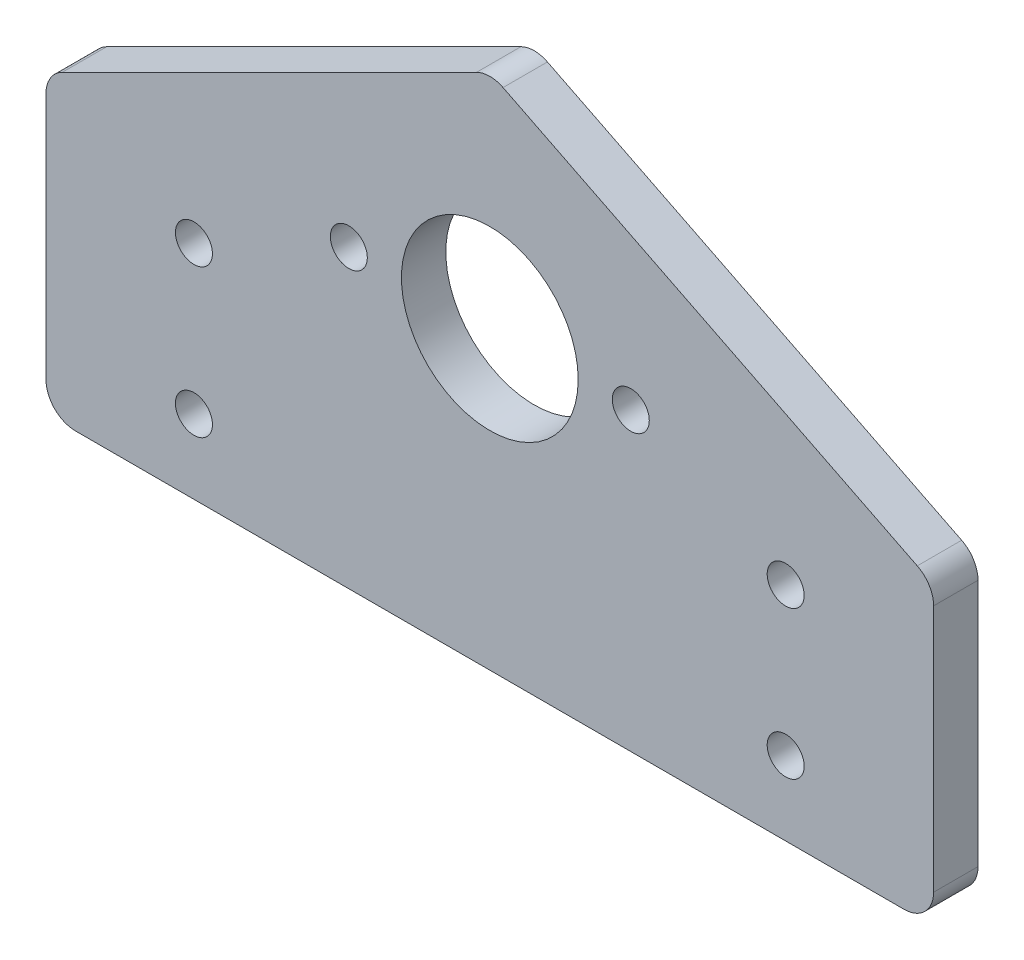
ISO-10303-21;
HEADER;
FILE_DESCRIPTION(('STEP AP214'),'2;1');
FILE_NAME('part.step','',(''),(''),'','','');
FILE_SCHEMA(('AUTOMOTIVE_DESIGN { 1 0 10303 214 1 1 1 1 }'));
ENDSEC;
DATA;
#1=APPLICATION_CONTEXT('core data for automotive mechanical design processes');
#2=APPLICATION_PROTOCOL_DEFINITION('international standard','automotive_design',2000,#1);
#3=PRODUCT_CONTEXT('',#1,'mechanical');
#4=PRODUCT('Part','Part','',(#3));
#5=PRODUCT_RELATED_PRODUCT_CATEGORY('part','',(#4));
#6=PRODUCT_DEFINITION_FORMATION('','',#4);
#7=PRODUCT_DEFINITION_CONTEXT('part definition',#1,'design');
#8=PRODUCT_DEFINITION('design','',#6,#7);
#9=PRODUCT_DEFINITION_SHAPE('','',#8);
#10=(LENGTH_UNIT() NAMED_UNIT(*) SI_UNIT(.MILLI.,.METRE.));
#11=(NAMED_UNIT(*) PLANE_ANGLE_UNIT() SI_UNIT($,.RADIAN.));
#12=(NAMED_UNIT(*) SI_UNIT($,.STERADIAN.) SOLID_ANGLE_UNIT());
#13=UNCERTAINTY_MEASURE_WITH_UNIT(LENGTH_MEASURE(1.E-05),#10,'distance_accuracy_value','');
#14=(GEOMETRIC_REPRESENTATION_CONTEXT(3) GLOBAL_UNCERTAINTY_ASSIGNED_CONTEXT((#13)) GLOBAL_UNIT_ASSIGNED_CONTEXT((#10,
#11,#12)) REPRESENTATION_CONTEXT('',''));
#15=CARTESIAN_POINT('',(0.,0.,0.));
#16=DIRECTION('',(0.,0.,1.));
#17=DIRECTION('',(1.,0.,0.));
#18=AXIS2_PLACEMENT_3D('',#15,#16,#17);
#19=CARTESIAN_POINT('',(0.,0.,3.));
#20=DIRECTION('',(0.,0.,-1.));
#21=DIRECTION('',(-1.,0.,0.));
#22=AXIS2_PLACEMENT_3D('',#19,#20,#21);
#23=PLANE('',#22);
#24=CARTESIAN_POINT('',(50.,5.,3.));
#25=DIRECTION('',(0.,0.,1.));
#26=DIRECTION('',(1.,0.,0.));
#27=AXIS2_PLACEMENT_3D('',#24,#25,#26);
#28=CIRCLE('',#27,1.25);
#29=CARTESIAN_POINT('',(51.25,5.,3.));
#30=VERTEX_POINT('',#29);
#31=EDGE_CURVE('E214',#30,#30,#28,.T.);
#32=ORIENTED_EDGE('',*,*,#31,.F.);
#33=EDGE_LOOP('',(#32));
#34=FACE_BOUND('',#33,.T.);
#35=CARTESIAN_POINT('',(10.,5.,3.));
#36=DIRECTION('',(0.,0.,1.));
#37=DIRECTION('',(1.,0.,0.));
#38=AXIS2_PLACEMENT_3D('',#35,#36,#37);
#39=CIRCLE('',#38,1.25);
#40=CARTESIAN_POINT('',(11.25,5.,3.));
#41=VERTEX_POINT('',#40);
#42=EDGE_CURVE('E220',#41,#41,#39,.T.);
#43=ORIENTED_EDGE('',*,*,#42,.F.);
#44=EDGE_LOOP('',(#43));
#45=FACE_BOUND('',#44,.T.);
#46=CARTESIAN_POINT('',(10.,15.,3.));
#47=DIRECTION('',(0.,0.,1.));
#48=DIRECTION('',(1.,0.,0.));
#49=AXIS2_PLACEMENT_3D('',#46,#47,#48);
#50=CIRCLE('',#49,1.25);
#51=CARTESIAN_POINT('',(11.25,15.,3.));
#52=VERTEX_POINT('',#51);
#53=EDGE_CURVE('E226',#52,#52,#50,.T.);
#54=ORIENTED_EDGE('',*,*,#53,.F.);
#55=EDGE_LOOP('',(#54));
#56=FACE_BOUND('',#55,.T.);
#57=CARTESIAN_POINT('',(50.,15.,3.));
#58=DIRECTION('',(0.,0.,1.));
#59=DIRECTION('',(1.,0.,0.));
#60=AXIS2_PLACEMENT_3D('',#57,#58,#59);
#61=CIRCLE('',#60,1.25);
#62=CARTESIAN_POINT('',(51.25,15.,3.));
#63=VERTEX_POINT('',#62);
#64=EDGE_CURVE('E208',#63,#63,#61,.T.);
#65=ORIENTED_EDGE('',*,*,#64,.F.);
#66=EDGE_LOOP('',(#65));
#67=FACE_BOUND('',#66,.T.);
#68=DIRECTION('',(0.,-1.,0.));
#69=VECTOR('',#68,1.);
#70=CARTESIAN_POINT('',(0.,0.,3.));
#71=LINE('',#70,#69);
#72=CARTESIAN_POINT('',(0.,18.7639320225002,3.));
#73=VERTEX_POINT('',#72);
#74=CARTESIAN_POINT('',(0.,2.,3.));
#75=VERTEX_POINT('',#74);
#76=EDGE_CURVE('E132',#73,#75,#71,.T.);
#77=ORIENTED_EDGE('',*,*,#76,.T.);
#78=CARTESIAN_POINT('',(2.,2.,3.));
#79=DIRECTION('',(0.,0.,-1.));
#80=DIRECTION('',(-1.,0.,0.));
#81=AXIS2_PLACEMENT_3D('',#78,#79,#80);
#82=CIRCLE('',#81,2.);
#83=CARTESIAN_POINT('',(2.,0.,3.));
#84=VERTEX_POINT('',#83);
#85=EDGE_CURVE('E158',#75,#84,#82,.F.);
#86=ORIENTED_EDGE('',*,*,#85,.T.);
#87=DIRECTION('',(1.,0.,0.));
#88=VECTOR('',#87,1.);
#89=CARTESIAN_POINT('',(60.,0.,3.));
#90=LINE('',#89,#88);
#91=CARTESIAN_POINT('',(58.,0.,3.));
#92=VERTEX_POINT('',#91);
#93=EDGE_CURVE('E115',#84,#92,#90,.T.);
#94=ORIENTED_EDGE('',*,*,#93,.T.);
#95=CARTESIAN_POINT('',(58.,2.,3.));
#96=DIRECTION('',(0.,0.,-1.));
#97=DIRECTION('',(-1.,0.,0.));
#98=AXIS2_PLACEMENT_3D('',#95,#96,#97);
#99=CIRCLE('',#98,2.);
#100=CARTESIAN_POINT('',(60.,2.,3.));
#101=VERTEX_POINT('',#100);
#102=EDGE_CURVE('E151',#92,#101,#99,.F.);
#103=ORIENTED_EDGE('',*,*,#102,.T.);
#104=DIRECTION('',(0.,1.,0.));
#105=VECTOR('',#104,1.);
#106=CARTESIAN_POINT('',(60.,20.,3.));
#107=LINE('',#106,#105);
#108=CARTESIAN_POINT('',(60.,18.7639320225002,3.));
#109=VERTEX_POINT('',#108);
#110=EDGE_CURVE('E175',#101,#109,#107,.T.);
#111=ORIENTED_EDGE('',*,*,#110,.T.);
#112=CARTESIAN_POINT('',(58.,18.7639320225002,3.));
#113=DIRECTION('',(0.,0.,-1.));
#114=DIRECTION('',(-1.,0.,0.));
#115=AXIS2_PLACEMENT_3D('',#112,#113,#114);
#116=CIRCLE('',#115,2.);
#117=CARTESIAN_POINT('',(58.8944271909999,20.5527864045,3.));
#118=VERTEX_POINT('',#117);
#119=EDGE_CURVE('E153',#109,#118,#116,.F.);
#120=ORIENTED_EDGE('',*,*,#119,.T.);
#121=DIRECTION('',(-0.894427190999916,0.447213595499958,0.));
#122=VECTOR('',#121,1.);
#123=CARTESIAN_POINT('',(30.,35.,3.));
#124=LINE('',#123,#122);
#125=CARTESIAN_POINT('',(30.8944271909999,34.5527864045001,3.));
#126=VERTEX_POINT('',#125);
#127=EDGE_CURVE('E187',#118,#126,#124,.T.);
#128=ORIENTED_EDGE('',*,*,#127,.T.);
#129=CARTESIAN_POINT('',(30.,32.7639320225002,3.));
#130=DIRECTION('',(0.,0.,-1.));
#131=DIRECTION('',(-1.,0.,0.));
#132=AXIS2_PLACEMENT_3D('',#129,#130,#131);
#133=CIRCLE('',#132,2.);
#134=CARTESIAN_POINT('',(29.1055728090001,34.5527864045001,3.));
#135=VERTEX_POINT('',#134);
#136=EDGE_CURVE('E39',#126,#135,#133,.F.);
#137=ORIENTED_EDGE('',*,*,#136,.T.);
#138=DIRECTION('',(-0.894427190999916,-0.447213595499958,0.));
#139=VECTOR('',#138,1.);
#140=CARTESIAN_POINT('',(0.,20.,3.));
#141=LINE('',#140,#139);
#142=CARTESIAN_POINT('',(1.10557280900009,20.5527864045,3.));
#143=VERTEX_POINT('',#142);
#144=EDGE_CURVE('E188',#135,#143,#141,.T.);
#145=ORIENTED_EDGE('',*,*,#144,.T.);
#146=CARTESIAN_POINT('',(2.,18.7639320225002,3.));
#147=DIRECTION('',(0.,0.,-1.));
#148=DIRECTION('',(-1.,0.,0.));
#149=AXIS2_PLACEMENT_3D('',#146,#147,#148);
#150=CIRCLE('',#149,2.);
#151=EDGE_CURVE('E156',#143,#73,#150,.F.);
#152=ORIENTED_EDGE('',*,*,#151,.T.);
#153=EDGE_LOOP('',(#77,#86,#94,#103,#111,#120,#128,#137,#145,#152));
#154=FACE_BOUND('',#153,.T.);
#155=CARTESIAN_POINT('',(30.,20.,3.));
#156=DIRECTION('',(0.,0.,1.));
#157=DIRECTION('',(1.,0.,0.));
#158=AXIS2_PLACEMENT_3D('',#155,#156,#157);
#159=CIRCLE('',#158,5.975);
#160=CARTESIAN_POINT('',(35.975,20.,3.));
#161=VERTEX_POINT('',#160);
#162=EDGE_CURVE('E123',#161,#161,#159,.T.);
#163=ORIENTED_EDGE('',*,*,#162,.F.);
#164=EDGE_LOOP('',(#163));
#165=FACE_BOUND('',#164,.T.);
#166=CARTESIAN_POINT('',(20.47,20.,3.));
#167=DIRECTION('',(0.,0.,1.));
#168=DIRECTION('',(1.,0.,0.));
#169=AXIS2_PLACEMENT_3D('',#166,#167,#168);
#170=CIRCLE('',#169,1.25);
#171=CARTESIAN_POINT('',(21.72,20.,3.));
#172=VERTEX_POINT('',#171);
#173=EDGE_CURVE('E194',#172,#172,#170,.T.);
#174=ORIENTED_EDGE('',*,*,#173,.F.);
#175=EDGE_LOOP('',(#174));
#176=FACE_BOUND('',#175,.T.);
#177=CARTESIAN_POINT('',(39.53,20.,3.));
#178=DIRECTION('',(0.,0.,1.));
#179=DIRECTION('',(1.,0.,0.));
#180=AXIS2_PLACEMENT_3D('',#177,#178,#179);
#181=CIRCLE('',#180,1.25);
#182=CARTESIAN_POINT('',(40.78,20.,3.));
#183=VERTEX_POINT('',#182);
#184=EDGE_CURVE('E199',#183,#183,#181,.T.);
#185=ORIENTED_EDGE('',*,*,#184,.F.);
#186=EDGE_LOOP('',(#185));
#187=FACE_BOUND('',#186,.T.);
#188=ADVANCED_FACE('F17',(#34,#45,#56,#67,#154,#165,#176,#187),#23,.F.);
#189=CARTESIAN_POINT('',(0.,0.,0.));
#190=DIRECTION('',(0.,0.,-1.));
#191=DIRECTION('',(-1.,0.,0.));
#192=AXIS2_PLACEMENT_3D('',#189,#190,#191);
#193=PLANE('',#192);
#194=CARTESIAN_POINT('',(50.,5.,0.));
#195=DIRECTION('',(0.,0.,1.));
#196=DIRECTION('',(1.,0.,0.));
#197=AXIS2_PLACEMENT_3D('',#194,#195,#196);
#198=CIRCLE('',#197,1.25);
#199=CARTESIAN_POINT('',(51.25,5.,0.));
#200=VERTEX_POINT('',#199);
#201=EDGE_CURVE('E217',#200,#200,#198,.T.);
#202=ORIENTED_EDGE('',*,*,#201,.T.);
#203=EDGE_LOOP('',(#202));
#204=FACE_BOUND('',#203,.T.);
#205=CARTESIAN_POINT('',(10.,5.,0.));
#206=DIRECTION('',(0.,0.,1.));
#207=DIRECTION('',(1.,0.,0.));
#208=AXIS2_PLACEMENT_3D('',#205,#206,#207);
#209=CIRCLE('',#208,1.25);
#210=CARTESIAN_POINT('',(11.25,5.,0.));
#211=VERTEX_POINT('',#210);
#212=EDGE_CURVE('E223',#211,#211,#209,.T.);
#213=ORIENTED_EDGE('',*,*,#212,.T.);
#214=EDGE_LOOP('',(#213));
#215=FACE_BOUND('',#214,.T.);
#216=CARTESIAN_POINT('',(10.,15.,0.));
#217=DIRECTION('',(0.,0.,1.));
#218=DIRECTION('',(1.,0.,0.));
#219=AXIS2_PLACEMENT_3D('',#216,#217,#218);
#220=CIRCLE('',#219,1.25);
#221=CARTESIAN_POINT('',(11.25,15.,0.));
#222=VERTEX_POINT('',#221);
#223=EDGE_CURVE('E211',#222,#222,#220,.T.);
#224=ORIENTED_EDGE('',*,*,#223,.T.);
#225=EDGE_LOOP('',(#224));
#226=FACE_BOUND('',#225,.T.);
#227=CARTESIAN_POINT('',(50.,15.,0.));
#228=DIRECTION('',(0.,0.,1.));
#229=DIRECTION('',(1.,0.,0.));
#230=AXIS2_PLACEMENT_3D('',#227,#228,#229);
#231=CIRCLE('',#230,1.25);
#232=CARTESIAN_POINT('',(51.25,15.,0.));
#233=VERTEX_POINT('',#232);
#234=EDGE_CURVE('E205',#233,#233,#231,.T.);
#235=ORIENTED_EDGE('',*,*,#234,.T.);
#236=EDGE_LOOP('',(#235));
#237=FACE_BOUND('',#236,.T.);
#238=CARTESIAN_POINT('',(20.47,20.,0.));
#239=DIRECTION('',(0.,0.,1.));
#240=DIRECTION('',(1.,0.,0.));
#241=AXIS2_PLACEMENT_3D('',#238,#239,#240);
#242=CIRCLE('',#241,1.25);
#243=CARTESIAN_POINT('',(21.72,20.,0.));
#244=VERTEX_POINT('',#243);
#245=EDGE_CURVE('E196',#244,#244,#242,.T.);
#246=ORIENTED_EDGE('',*,*,#245,.T.);
#247=EDGE_LOOP('',(#246));
#248=FACE_BOUND('',#247,.T.);
#249=DIRECTION('',(1.,0.,0.));
#250=VECTOR('',#249,1.);
#251=CARTESIAN_POINT('',(60.,0.,0.));
#252=LINE('',#251,#250);
#253=CARTESIAN_POINT('',(2.,0.,0.));
#254=VERTEX_POINT('',#253);
#255=CARTESIAN_POINT('',(58.,0.,0.));
#256=VERTEX_POINT('',#255);
#257=EDGE_CURVE('E112',#254,#256,#252,.T.);
#258=ORIENTED_EDGE('',*,*,#257,.F.);
#259=CARTESIAN_POINT('',(2.,2.,0.));
#260=DIRECTION('',(0.,0.,-1.));
#261=DIRECTION('',(-1.,0.,0.));
#262=AXIS2_PLACEMENT_3D('',#259,#260,#261);
#263=CIRCLE('',#262,2.);
#264=CARTESIAN_POINT('',(0.,2.,0.));
#265=VERTEX_POINT('',#264);
#266=EDGE_CURVE('E95',#254,#265,#263,.T.);
#267=ORIENTED_EDGE('',*,*,#266,.T.);
#268=DIRECTION('',(0.,-1.,0.));
#269=VECTOR('',#268,1.);
#270=CARTESIAN_POINT('',(0.,0.,0.));
#271=LINE('',#270,#269);
#272=CARTESIAN_POINT('',(0.,18.7639320225002,0.));
#273=VERTEX_POINT('',#272);
#274=EDGE_CURVE('E139',#273,#265,#271,.T.);
#275=ORIENTED_EDGE('',*,*,#274,.F.);
#276=CARTESIAN_POINT('',(2.,18.7639320225002,0.));
#277=DIRECTION('',(0.,0.,-1.));
#278=DIRECTION('',(-1.,0.,0.));
#279=AXIS2_PLACEMENT_3D('',#276,#277,#278);
#280=CIRCLE('',#279,2.);
#281=CARTESIAN_POINT('',(1.10557280900009,20.5527864045,0.));
#282=VERTEX_POINT('',#281);
#283=EDGE_CURVE('E106',#273,#282,#280,.T.);
#284=ORIENTED_EDGE('',*,*,#283,.T.);
#285=DIRECTION('',(-0.894427190999916,-0.447213595499958,0.));
#286=VECTOR('',#285,1.);
#287=CARTESIAN_POINT('',(0.,20.,0.));
#288=LINE('',#287,#286);
#289=CARTESIAN_POINT('',(29.1055728090001,34.5527864045001,0.));
#290=VERTEX_POINT('',#289);
#291=EDGE_CURVE('E137',#290,#282,#288,.T.);
#292=ORIENTED_EDGE('',*,*,#291,.F.);
#293=CARTESIAN_POINT('',(30.,32.7639320225002,0.));
#294=DIRECTION('',(0.,0.,-1.));
#295=DIRECTION('',(-1.,0.,0.));
#296=AXIS2_PLACEMENT_3D('',#293,#294,#295);
#297=CIRCLE('',#296,2.);
#298=CARTESIAN_POINT('',(30.8944271909999,34.5527864045001,0.));
#299=VERTEX_POINT('',#298);
#300=EDGE_CURVE('E145',#290,#299,#297,.T.);
#301=ORIENTED_EDGE('',*,*,#300,.T.);
#302=DIRECTION('',(-0.894427190999916,0.447213595499958,0.));
#303=VECTOR('',#302,1.);
#304=CARTESIAN_POINT('',(30.,35.,0.));
#305=LINE('',#304,#303);
#306=CARTESIAN_POINT('',(58.8944271909999,20.5527864045,0.));
#307=VERTEX_POINT('',#306);
#308=EDGE_CURVE('E126',#307,#299,#305,.T.);
#309=ORIENTED_EDGE('',*,*,#308,.F.);
#310=CARTESIAN_POINT('',(58.,18.7639320225002,0.));
#311=DIRECTION('',(0.,0.,-1.));
#312=DIRECTION('',(-1.,0.,0.));
#313=AXIS2_PLACEMENT_3D('',#310,#311,#312);
#314=CIRCLE('',#313,2.);
#315=CARTESIAN_POINT('',(60.,18.7639320225002,0.));
#316=VERTEX_POINT('',#315);
#317=EDGE_CURVE('E143',#307,#316,#314,.T.);
#318=ORIENTED_EDGE('',*,*,#317,.T.);
#319=DIRECTION('',(0.,1.,0.));
#320=VECTOR('',#319,1.);
#321=CARTESIAN_POINT('',(60.,20.,0.));
#322=LINE('',#321,#320);
#323=CARTESIAN_POINT('',(60.,2.,0.));
#324=VERTEX_POINT('',#323);
#325=EDGE_CURVE('E122',#324,#316,#322,.T.);
#326=ORIENTED_EDGE('',*,*,#325,.F.);
#327=CARTESIAN_POINT('',(58.,2.,0.));
#328=DIRECTION('',(0.,0.,-1.));
#329=DIRECTION('',(-1.,0.,0.));
#330=AXIS2_PLACEMENT_3D('',#327,#328,#329);
#331=CIRCLE('',#330,2.);
#332=EDGE_CURVE('E116',#324,#256,#331,.T.);
#333=ORIENTED_EDGE('',*,*,#332,.T.);
#334=EDGE_LOOP('',(#258,#267,#275,#284,#292,#301,#309,#318,#326,#333));
#335=FACE_BOUND('',#334,.T.);
#336=CARTESIAN_POINT('',(30.,20.,0.));
#337=DIRECTION('',(0.,0.,1.));
#338=DIRECTION('',(1.,0.,0.));
#339=AXIS2_PLACEMENT_3D('',#336,#337,#338);
#340=CIRCLE('',#339,5.975);
#341=CARTESIAN_POINT('',(35.975,20.,0.));
#342=VERTEX_POINT('',#341);
#343=EDGE_CURVE('E129',#342,#342,#340,.T.);
#344=ORIENTED_EDGE('',*,*,#343,.T.);
#345=EDGE_LOOP('',(#344));
#346=FACE_BOUND('',#345,.T.);
#347=CARTESIAN_POINT('',(39.53,20.,0.));
#348=DIRECTION('',(0.,0.,1.));
#349=DIRECTION('',(1.,0.,0.));
#350=AXIS2_PLACEMENT_3D('',#347,#348,#349);
#351=CIRCLE('',#350,1.25);
#352=CARTESIAN_POINT('',(40.78,20.,0.));
#353=VERTEX_POINT('',#352);
#354=EDGE_CURVE('E202',#353,#353,#351,.T.);
#355=ORIENTED_EDGE('',*,*,#354,.T.);
#356=EDGE_LOOP('',(#355));
#357=FACE_BOUND('',#356,.T.);
#358=ADVANCED_FACE('F119',(#204,#215,#226,#237,#248,#335,#346,#357),#193,.T.);
#359=CARTESIAN_POINT('',(60.,0.,3.));
#360=DIRECTION('',(0.,1.,0.));
#361=DIRECTION('',(-1.,0.,0.));
#362=AXIS2_PLACEMENT_3D('',#359,#360,#361);
#363=PLANE('',#362);
#364=ORIENTED_EDGE('',*,*,#93,.F.);
#365=DIRECTION('',(0.,0.,-1.));
#366=VECTOR('',#365,1.);
#367=CARTESIAN_POINT('',(2.,0.,3.));
#368=LINE('',#367,#366);
#369=EDGE_CURVE('E99',#84,#254,#368,.T.);
#370=ORIENTED_EDGE('',*,*,#369,.T.);
#371=ORIENTED_EDGE('',*,*,#257,.T.);
#372=DIRECTION('',(0.,0.,-1.));
#373=VECTOR('',#372,1.);
#374=CARTESIAN_POINT('',(58.,0.,3.));
#375=LINE('',#374,#373);
#376=EDGE_CURVE('E117',#256,#92,#375,.F.);
#377=ORIENTED_EDGE('',*,*,#376,.T.);
#378=EDGE_LOOP('',(#364,#370,#371,#377));
#379=FACE_BOUND('',#378,.T.);
#380=ADVANCED_FACE('F111',(#379),#363,.F.);
#381=CARTESIAN_POINT('',(60.,20.,3.));
#382=DIRECTION('',(-1.,0.,0.));
#383=DIRECTION('',(0.,-1.,0.));
#384=AXIS2_PLACEMENT_3D('',#381,#382,#383);
#385=PLANE('',#384);
#386=ORIENTED_EDGE('',*,*,#325,.T.);
#387=DIRECTION('',(0.,0.,-1.));
#388=VECTOR('',#387,1.);
#389=CARTESIAN_POINT('',(60.,18.7639320225002,3.));
#390=LINE('',#389,#388);
#391=EDGE_CURVE('E11',#316,#109,#390,.F.);
#392=ORIENTED_EDGE('',*,*,#391,.T.);
#393=ORIENTED_EDGE('',*,*,#110,.F.);
#394=DIRECTION('',(0.,0.,-1.));
#395=VECTOR('',#394,1.);
#396=CARTESIAN_POINT('',(60.,2.,3.));
#397=LINE('',#396,#395);
#398=EDGE_CURVE('E25',#101,#324,#397,.T.);
#399=ORIENTED_EDGE('',*,*,#398,.T.);
#400=EDGE_LOOP('',(#386,#392,#393,#399));
#401=FACE_BOUND('',#400,.T.);
#402=ADVANCED_FACE('F172',(#401),#385,.F.);
#403=CARTESIAN_POINT('',(30.,35.,3.));
#404=DIRECTION('',(-0.447213595499958,-0.894427190999916,0.));
#405=DIRECTION('',(0.894427190999916,-0.447213595499958,0.));
#406=AXIS2_PLACEMENT_3D('',#403,#404,#405);
#407=PLANE('',#406);
#408=ORIENTED_EDGE('',*,*,#308,.T.);
#409=DIRECTION('',(0.,0.,-1.));
#410=VECTOR('',#409,1.);
#411=CARTESIAN_POINT('',(30.8944271909999,34.5527864045001,3.));
#412=LINE('',#411,#410);
#413=EDGE_CURVE('E167',#299,#126,#412,.F.);
#414=ORIENTED_EDGE('',*,*,#413,.T.);
#415=ORIENTED_EDGE('',*,*,#127,.F.);
#416=DIRECTION('',(0.,0.,-1.));
#417=VECTOR('',#416,1.);
#418=CARTESIAN_POINT('',(58.8944271909999,20.5527864045,3.));
#419=LINE('',#418,#417);
#420=EDGE_CURVE('E164',#118,#307,#419,.T.);
#421=ORIENTED_EDGE('',*,*,#420,.T.);
#422=EDGE_LOOP('',(#408,#414,#415,#421));
#423=FACE_BOUND('',#422,.T.);
#424=ADVANCED_FACE('F185',(#423),#407,.F.);
#425=CARTESIAN_POINT('',(0.,20.,3.));
#426=DIRECTION('',(0.447213595499958,-0.894427190999916,0.));
#427=DIRECTION('',(0.894427190999916,0.447213595499958,0.));
#428=AXIS2_PLACEMENT_3D('',#425,#426,#427);
#429=PLANE('',#428);
#430=ORIENTED_EDGE('',*,*,#291,.T.);
#431=DIRECTION('',(0.,0.,-1.));
#432=VECTOR('',#431,1.);
#433=CARTESIAN_POINT('',(1.10557280900009,20.5527864045,3.));
#434=LINE('',#433,#432);
#435=EDGE_CURVE('E32',#282,#143,#434,.F.);
#436=ORIENTED_EDGE('',*,*,#435,.T.);
#437=ORIENTED_EDGE('',*,*,#144,.F.);
#438=DIRECTION('',(0.,0.,-1.));
#439=VECTOR('',#438,1.);
#440=CARTESIAN_POINT('',(29.1055728090001,34.5527864045001,3.));
#441=LINE('',#440,#439);
#442=EDGE_CURVE('E160',#135,#290,#441,.T.);
#443=ORIENTED_EDGE('',*,*,#442,.T.);
#444=EDGE_LOOP('',(#430,#436,#437,#443));
#445=FACE_BOUND('',#444,.T.);
#446=ADVANCED_FACE('F279',(#445),#429,.F.);
#447=CARTESIAN_POINT('',(0.,0.,3.));
#448=DIRECTION('',(1.,0.,0.));
#449=DIRECTION('',(0.,0.,-1.));
#450=AXIS2_PLACEMENT_3D('',#447,#448,#449);
#451=PLANE('',#450);
#452=ORIENTED_EDGE('',*,*,#274,.T.);
#453=DIRECTION('',(0.,0.,-1.));
#454=VECTOR('',#453,1.);
#455=CARTESIAN_POINT('',(0.,2.,3.));
#456=LINE('',#455,#454);
#457=EDGE_CURVE('E100',#265,#75,#456,.F.);
#458=ORIENTED_EDGE('',*,*,#457,.T.);
#459=ORIENTED_EDGE('',*,*,#76,.F.);
#460=DIRECTION('',(0.,0.,-1.));
#461=VECTOR('',#460,1.);
#462=CARTESIAN_POINT('',(0.,18.7639320225002,3.));
#463=LINE('',#462,#461);
#464=EDGE_CURVE('E105',#73,#273,#463,.T.);
#465=ORIENTED_EDGE('',*,*,#464,.T.);
#466=EDGE_LOOP('',(#452,#458,#459,#465));
#467=FACE_BOUND('',#466,.T.);
#468=ADVANCED_FACE('F275',(#467),#451,.F.);
#469=CARTESIAN_POINT('',(30.,20.,3.));
#470=DIRECTION('',(0.,0.,-1.));
#471=DIRECTION('',(-1.,0.,0.));
#472=AXIS2_PLACEMENT_3D('',#469,#470,#471);
#473=CYLINDRICAL_SURFACE('',#472,5.975);
#474=ORIENTED_EDGE('',*,*,#162,.T.);
#475=EDGE_LOOP('',(#474));
#476=FACE_BOUND('',#475,.T.);
#477=ORIENTED_EDGE('',*,*,#343,.F.);
#478=EDGE_LOOP('',(#477));
#479=FACE_BOUND('',#478,.T.);
#480=ADVANCED_FACE('F278',(#476,#479),#473,.F.);
#481=CARTESIAN_POINT('',(20.47,20.,3.));
#482=DIRECTION('',(0.,0.,-1.));
#483=DIRECTION('',(-1.,0.,0.));
#484=AXIS2_PLACEMENT_3D('',#481,#482,#483);
#485=CYLINDRICAL_SURFACE('',#484,1.25);
#486=ORIENTED_EDGE('',*,*,#173,.T.);
#487=EDGE_LOOP('',(#486));
#488=FACE_BOUND('',#487,.T.);
#489=ORIENTED_EDGE('',*,*,#245,.F.);
#490=EDGE_LOOP('',(#489));
#491=FACE_BOUND('',#490,.T.);
#492=ADVANCED_FACE('F259',(#488,#491),#485,.F.);
#493=CARTESIAN_POINT('',(39.53,20.,3.));
#494=DIRECTION('',(0.,0.,-1.));
#495=DIRECTION('',(-1.,0.,0.));
#496=AXIS2_PLACEMENT_3D('',#493,#494,#495);
#497=CYLINDRICAL_SURFACE('',#496,1.25);
#498=ORIENTED_EDGE('',*,*,#184,.T.);
#499=EDGE_LOOP('',(#498));
#500=FACE_BOUND('',#499,.T.);
#501=ORIENTED_EDGE('',*,*,#354,.F.);
#502=EDGE_LOOP('',(#501));
#503=FACE_BOUND('',#502,.T.);
#504=ADVANCED_FACE('F256',(#500,#503),#497,.F.);
#505=CARTESIAN_POINT('',(50.,15.,0.));
#506=DIRECTION('',(0.,0.,1.));
#507=DIRECTION('',(1.,0.,0.));
#508=AXIS2_PLACEMENT_3D('',#505,#506,#507);
#509=CYLINDRICAL_SURFACE('',#508,1.25);
#510=ORIENTED_EDGE('',*,*,#234,.F.);
#511=EDGE_LOOP('',(#510));
#512=FACE_BOUND('',#511,.T.);
#513=ORIENTED_EDGE('',*,*,#64,.T.);
#514=EDGE_LOOP('',(#513));
#515=FACE_BOUND('',#514,.T.);
#516=ADVANCED_FACE('F238',(#512,#515),#509,.F.);
#517=CARTESIAN_POINT('',(10.,15.,0.));
#518=DIRECTION('',(0.,0.,1.));
#519=DIRECTION('',(1.,0.,0.));
#520=AXIS2_PLACEMENT_3D('',#517,#518,#519);
#521=CYLINDRICAL_SURFACE('',#520,1.25);
#522=ORIENTED_EDGE('',*,*,#223,.F.);
#523=EDGE_LOOP('',(#522));
#524=FACE_BOUND('',#523,.T.);
#525=ORIENTED_EDGE('',*,*,#53,.T.);
#526=EDGE_LOOP('',(#525));
#527=FACE_BOUND('',#526,.T.);
#528=ADVANCED_FACE('F234',(#524,#527),#521,.F.);
#529=CARTESIAN_POINT('',(10.,5.,0.));
#530=DIRECTION('',(0.,0.,1.));
#531=DIRECTION('',(1.,0.,0.));
#532=AXIS2_PLACEMENT_3D('',#529,#530,#531);
#533=CYLINDRICAL_SURFACE('',#532,1.25);
#534=ORIENTED_EDGE('',*,*,#212,.F.);
#535=EDGE_LOOP('',(#534));
#536=FACE_BOUND('',#535,.T.);
#537=ORIENTED_EDGE('',*,*,#42,.T.);
#538=EDGE_LOOP('',(#537));
#539=FACE_BOUND('',#538,.T.);
#540=ADVANCED_FACE('F237',(#536,#539),#533,.F.);
#541=CARTESIAN_POINT('',(50.,5.,0.));
#542=DIRECTION('',(0.,0.,1.));
#543=DIRECTION('',(1.,0.,0.));
#544=AXIS2_PLACEMENT_3D('',#541,#542,#543);
#545=CYLINDRICAL_SURFACE('',#544,1.25);
#546=ORIENTED_EDGE('',*,*,#201,.F.);
#547=EDGE_LOOP('',(#546));
#548=FACE_BOUND('',#547,.T.);
#549=ORIENTED_EDGE('',*,*,#31,.T.);
#550=EDGE_LOOP('',(#549));
#551=FACE_BOUND('',#550,.T.);
#552=ADVANCED_FACE('F290',(#548,#551),#545,.F.);
#553=CARTESIAN_POINT('',(2.,2.,3.));
#554=DIRECTION('',(0.,0.,-1.));
#555=DIRECTION('',(-1.,0.,0.));
#556=AXIS2_PLACEMENT_3D('',#553,#554,#555);
#557=CYLINDRICAL_SURFACE('',#556,2.);
#558=ORIENTED_EDGE('',*,*,#85,.F.);
#559=ORIENTED_EDGE('',*,*,#457,.F.);
#560=ORIENTED_EDGE('',*,*,#266,.F.);
#561=ORIENTED_EDGE('',*,*,#369,.F.);
#562=EDGE_LOOP('',(#558,#559,#560,#561));
#563=FACE_BOUND('',#562,.T.);
#564=ADVANCED_FACE('F98',(#563),#557,.T.);
#565=CARTESIAN_POINT('',(2.,18.7639320225002,3.));
#566=DIRECTION('',(0.,0.,-1.));
#567=DIRECTION('',(-1.,0.,0.));
#568=AXIS2_PLACEMENT_3D('',#565,#566,#567);
#569=CYLINDRICAL_SURFACE('',#568,2.);
#570=ORIENTED_EDGE('',*,*,#151,.F.);
#571=ORIENTED_EDGE('',*,*,#435,.F.);
#572=ORIENTED_EDGE('',*,*,#283,.F.);
#573=ORIENTED_EDGE('',*,*,#464,.F.);
#574=EDGE_LOOP('',(#570,#571,#572,#573));
#575=FACE_BOUND('',#574,.T.);
#576=ADVANCED_FACE('F289',(#575),#569,.T.);
#577=CARTESIAN_POINT('',(30.,32.7639320225002,3.));
#578=DIRECTION('',(0.,0.,-1.));
#579=DIRECTION('',(-1.,0.,0.));
#580=AXIS2_PLACEMENT_3D('',#577,#578,#579);
#581=CYLINDRICAL_SURFACE('',#580,2.);
#582=ORIENTED_EDGE('',*,*,#136,.F.);
#583=ORIENTED_EDGE('',*,*,#413,.F.);
#584=ORIENTED_EDGE('',*,*,#300,.F.);
#585=ORIENTED_EDGE('',*,*,#442,.F.);
#586=EDGE_LOOP('',(#582,#583,#584,#585));
#587=FACE_BOUND('',#586,.T.);
#588=ADVANCED_FACE('F293',(#587),#581,.T.);
#589=CARTESIAN_POINT('',(58.,18.7639320225002,3.));
#590=DIRECTION('',(0.,0.,-1.));
#591=DIRECTION('',(-1.,0.,0.));
#592=AXIS2_PLACEMENT_3D('',#589,#590,#591);
#593=CYLINDRICAL_SURFACE('',#592,2.);
#594=ORIENTED_EDGE('',*,*,#119,.F.);
#595=ORIENTED_EDGE('',*,*,#391,.F.);
#596=ORIENTED_EDGE('',*,*,#317,.F.);
#597=ORIENTED_EDGE('',*,*,#420,.F.);
#598=EDGE_LOOP('',(#594,#595,#596,#597));
#599=FACE_BOUND('',#598,.T.);
#600=ADVANCED_FACE('F182',(#599),#593,.T.);
#601=CARTESIAN_POINT('',(58.,2.,3.));
#602=DIRECTION('',(0.,0.,-1.));
#603=DIRECTION('',(-1.,0.,0.));
#604=AXIS2_PLACEMENT_3D('',#601,#602,#603);
#605=CYLINDRICAL_SURFACE('',#604,2.);
#606=ORIENTED_EDGE('',*,*,#102,.F.);
#607=ORIENTED_EDGE('',*,*,#376,.F.);
#608=ORIENTED_EDGE('',*,*,#332,.F.);
#609=ORIENTED_EDGE('',*,*,#398,.F.);
#610=EDGE_LOOP('',(#606,#607,#608,#609));
#611=FACE_BOUND('',#610,.T.);
#612=ADVANCED_FACE('F19',(#611),#605,.T.);
#613=CLOSED_SHELL('',(#188,#358,#380,#402,#424,#446,#468,#480,#492,#504,#516,#528,#540,#552,
#564,#576,#588,#600,#612));
#614=MANIFOLD_SOLID_BREP('B1',#613);
#615=ADVANCED_BREP_SHAPE_REPRESENTATION('',(#18,#614),#14);
#616=SHAPE_DEFINITION_REPRESENTATION(#9,#615);
ENDSEC;
END-ISO-10303-21;
